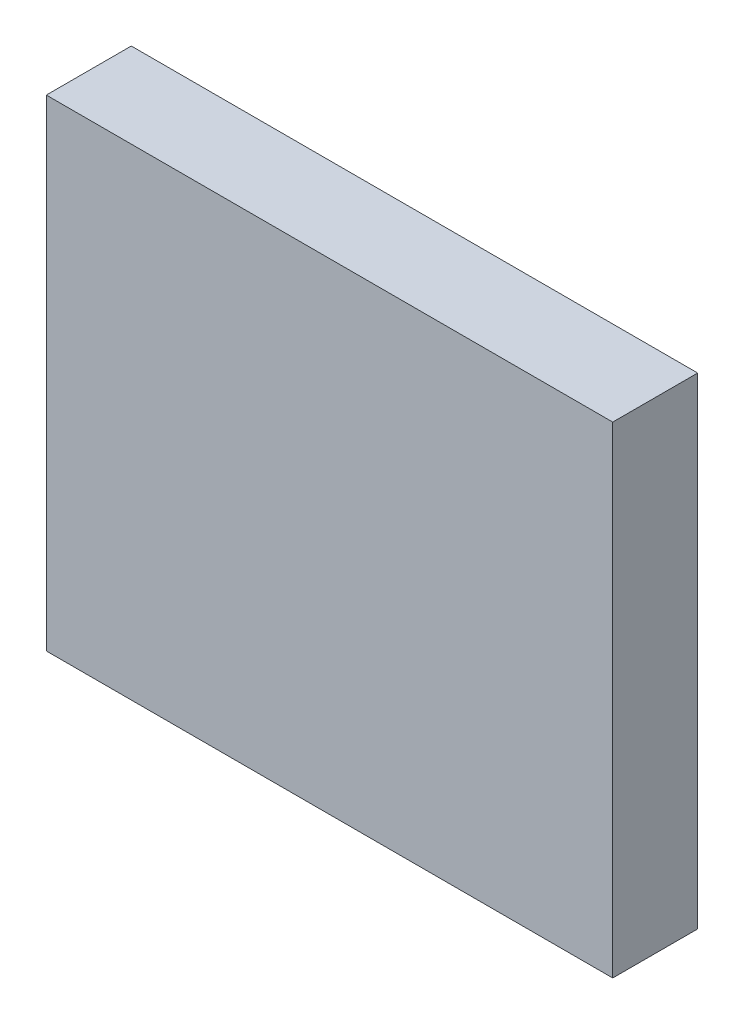
ISO-10303-21;
HEADER;
FILE_DESCRIPTION(('STEP AP214'),'2;1');
FILE_NAME('part.step','',(''),(''),'','','');
FILE_SCHEMA(('AUTOMOTIVE_DESIGN { 1 0 10303 214 1 1 1 1 }'));
ENDSEC;
DATA;
#1=APPLICATION_CONTEXT('core data for automotive mechanical design processes');
#2=APPLICATION_PROTOCOL_DEFINITION('international standard','automotive_design',2000,#1);
#3=PRODUCT_CONTEXT('',#1,'mechanical');
#4=PRODUCT('Part','Part','',(#3));
#5=PRODUCT_RELATED_PRODUCT_CATEGORY('part','',(#4));
#6=PRODUCT_DEFINITION_FORMATION('','',#4);
#7=PRODUCT_DEFINITION_CONTEXT('part definition',#1,'design');
#8=PRODUCT_DEFINITION('design','',#6,#7);
#9=PRODUCT_DEFINITION_SHAPE('','',#8);
#10=(LENGTH_UNIT() NAMED_UNIT(*) SI_UNIT(.MILLI.,.METRE.));
#11=(NAMED_UNIT(*) PLANE_ANGLE_UNIT() SI_UNIT($,.RADIAN.));
#12=(NAMED_UNIT(*) SI_UNIT($,.STERADIAN.) SOLID_ANGLE_UNIT());
#13=UNCERTAINTY_MEASURE_WITH_UNIT(LENGTH_MEASURE(1.E-05),#10,'distance_accuracy_value','');
#14=(GEOMETRIC_REPRESENTATION_CONTEXT(3) GLOBAL_UNCERTAINTY_ASSIGNED_CONTEXT((#13)) GLOBAL_UNIT_ASSIGNED_CONTEXT((#10,
#11,#12)) REPRESENTATION_CONTEXT('',''));
#15=CARTESIAN_POINT('',(0.,0.,0.));
#16=DIRECTION('',(0.,0.,1.));
#17=DIRECTION('',(1.,0.,0.));
#18=AXIS2_PLACEMENT_3D('',#15,#16,#17);
#19=CARTESIAN_POINT('',(-2.50500129639073,21.9529999999915,-5.03699993991845));
#20=DIRECTION('',(0.,-1.,0.));
#21=DIRECTION('',(0.,0.,-1.));
#22=AXIS2_PLACEMENT_3D('',#19,#20,#21);
#23=PLANE('',#22);
#24=DIRECTION('',(0.,0.,-1.));
#25=VECTOR('',#24,1.);
#26=CARTESIAN_POINT('',(12.4949987036093,21.9529999999915,-5.0369999549388));
#27=LINE('',#26,#25);
#28=CARTESIAN_POINT('',(12.4949987036093,21.9529999999915,-2.0369999399184));
#29=VERTEX_POINT('',#28);
#30=CARTESIAN_POINT('',(12.4949987036093,21.9529999999915,-8.037));
#31=VERTEX_POINT('',#30);
#32=EDGE_CURVE('E94',#29,#31,#27,.T.);
#33=ORIENTED_EDGE('',*,*,#32,.T.);
#34=DIRECTION('',(1.,0.,0.));
#35=VECTOR('',#34,1.);
#36=CARTESIAN_POINT('',(-2.50500129639072,21.9529999999915,-8.03699993991845));
#37=LINE('',#36,#35);
#38=CARTESIAN_POINT('',(-27.5050012963907,21.9529999999915,-8.03699993991852));
#39=VERTEX_POINT('',#38);
#40=EDGE_CURVE('E20',#39,#31,#37,.T.);
#41=ORIENTED_EDGE('',*,*,#40,.F.);
#42=DIRECTION('',(0.,0.,-1.));
#43=VECTOR('',#42,1.);
#44=CARTESIAN_POINT('',(-27.5050012963907,21.9529999999915,-5.03699993991852));
#45=LINE('',#44,#43);
#46=CARTESIAN_POINT('',(-27.5050012963907,21.9529999999915,-2.03699993991852));
#47=VERTEX_POINT('',#46);
#48=EDGE_CURVE('E11',#47,#39,#45,.T.);
#49=ORIENTED_EDGE('',*,*,#48,.F.);
#50=DIRECTION('',(-1.,0.,0.));
#51=VECTOR('',#50,1.);
#52=CARTESIAN_POINT('',(-2.50500129639074,21.9529999999915,-2.03699993991844));
#53=LINE('',#52,#51);
#54=EDGE_CURVE('E79',#29,#47,#53,.T.);
#55=ORIENTED_EDGE('',*,*,#54,.F.);
#56=EDGE_LOOP('',(#33,#41,#49,#55));
#57=FACE_BOUND('',#56,.T.);
#58=ADVANCED_FACE('F17',(#57),#23,.F.);
#59=CARTESIAN_POINT('',(-27.5050012963907,4.95299999999155,-5.03699993991852));
#60=DIRECTION('',(1.,0.,0.));
#61=DIRECTION('',(0.,0.,1.));
#62=AXIS2_PLACEMENT_3D('',#59,#60,#61);
#63=PLANE('',#62);
#64=ORIENTED_EDGE('',*,*,#48,.T.);
#65=DIRECTION('',(0.,1.,0.));
#66=VECTOR('',#65,1.);
#67=CARTESIAN_POINT('',(-27.5050012963907,4.95299999999155,-8.03699993991852));
#68=LINE('',#67,#66);
#69=CARTESIAN_POINT('',(-27.5050012963907,-12.0470000000085,-8.03699993991852));
#70=VERTEX_POINT('',#69);
#71=EDGE_CURVE('E59',#70,#39,#68,.T.);
#72=ORIENTED_EDGE('',*,*,#71,.F.);
#73=DIRECTION('',(0.,0.,-1.));
#74=VECTOR('',#73,1.);
#75=CARTESIAN_POINT('',(-27.5050012963907,-12.0470000000085,-5.03699993991852));
#76=LINE('',#75,#74);
#77=CARTESIAN_POINT('',(-27.5050012963907,-12.0470000000085,-2.03699993991852));
#78=VERTEX_POINT('',#77);
#79=EDGE_CURVE('E63',#78,#70,#76,.T.);
#80=ORIENTED_EDGE('',*,*,#79,.F.);
#81=DIRECTION('',(0.,-1.,0.));
#82=VECTOR('',#81,1.);
#83=CARTESIAN_POINT('',(-27.5050012963907,4.95299999999155,-2.03699993991852));
#84=LINE('',#83,#82);
#85=EDGE_CURVE('E67',#47,#78,#84,.T.);
#86=ORIENTED_EDGE('',*,*,#85,.F.);
#87=EDGE_LOOP('',(#64,#72,#80,#86));
#88=FACE_BOUND('',#87,.T.);
#89=ADVANCED_FACE('F61',(#88),#63,.F.);
#90=CARTESIAN_POINT('',(-2.50500129639072,4.95299999999155,-8.03699993991845));
#91=DIRECTION('',(0.,0.,1.));
#92=DIRECTION('',(1.,0.,0.));
#93=AXIS2_PLACEMENT_3D('',#90,#91,#92);
#94=PLANE('',#93);
#95=DIRECTION('',(0.,-1.,0.));
#96=VECTOR('',#95,1.);
#97=CARTESIAN_POINT('',(12.4949987036093,4.71474995156489,-8.0369999399184));
#98=LINE('',#97,#96);
#99=CARTESIAN_POINT('',(12.4949987036093,-12.0470000000085,-8.037));
#100=VERTEX_POINT('',#99);
#101=EDGE_CURVE('E74',#31,#100,#98,.T.);
#102=ORIENTED_EDGE('',*,*,#101,.T.);
#103=DIRECTION('',(-1.,0.,0.));
#104=VECTOR('',#103,1.);
#105=CARTESIAN_POINT('',(-2.50500129639072,-12.0470000000085,-8.03699993991845));
#106=LINE('',#105,#104);
#107=EDGE_CURVE('E70',#100,#70,#106,.T.);
#108=ORIENTED_EDGE('',*,*,#107,.T.);
#109=ORIENTED_EDGE('',*,*,#71,.T.);
#110=ORIENTED_EDGE('',*,*,#40,.T.);
#111=EDGE_LOOP('',(#102,#108,#109,#110));
#112=FACE_BOUND('',#111,.T.);
#113=ADVANCED_FACE('F71',(#112),#94,.F.);
#114=CARTESIAN_POINT('',(-2.50500129639074,4.95299999999155,-2.03699993991844));
#115=DIRECTION('',(0.,0.,1.));
#116=DIRECTION('',(1.,0.,0.));
#117=AXIS2_PLACEMENT_3D('',#114,#115,#116);
#118=PLANE('',#117);
#119=DIRECTION('',(0.,1.,0.));
#120=VECTOR('',#119,1.);
#121=CARTESIAN_POINT('',(12.4949987036093,4.71474995156489,-2.0369999399184));
#122=LINE('',#121,#120);
#123=CARTESIAN_POINT('',(12.4949987036093,-12.0470000000085,-2.0369999399184));
#124=VERTEX_POINT('',#123);
#125=EDGE_CURVE('E90',#124,#29,#122,.T.);
#126=ORIENTED_EDGE('',*,*,#125,.T.);
#127=ORIENTED_EDGE('',*,*,#54,.T.);
#128=ORIENTED_EDGE('',*,*,#85,.T.);
#129=DIRECTION('',(1.,0.,0.));
#130=VECTOR('',#129,1.);
#131=CARTESIAN_POINT('',(-2.50500129639074,-12.0470000000085,-2.03699993991844));
#132=LINE('',#131,#130);
#133=EDGE_CURVE('E83',#78,#124,#132,.T.);
#134=ORIENTED_EDGE('',*,*,#133,.T.);
#135=EDGE_LOOP('',(#126,#127,#128,#134));
#136=FACE_BOUND('',#135,.T.);
#137=ADVANCED_FACE('F106',(#136),#118,.T.);
#138=CARTESIAN_POINT('',(-2.50500129639073,-12.0470000000085,-5.03699993991845));
#139=DIRECTION('',(0.,1.,0.));
#140=DIRECTION('',(1.,0.,0.));
#141=AXIS2_PLACEMENT_3D('',#138,#139,#140);
#142=PLANE('',#141);
#143=DIRECTION('',(0.,0.,1.));
#144=VECTOR('',#143,1.);
#145=CARTESIAN_POINT('',(12.4949987036093,-12.0470000000085,-5.0369999549388));
#146=LINE('',#145,#144);
#147=EDGE_CURVE('E145',#100,#124,#146,.T.);
#148=ORIENTED_EDGE('',*,*,#147,.T.);
#149=ORIENTED_EDGE('',*,*,#133,.F.);
#150=ORIENTED_EDGE('',*,*,#79,.T.);
#151=ORIENTED_EDGE('',*,*,#107,.F.);
#152=EDGE_LOOP('',(#148,#149,#150,#151));
#153=FACE_BOUND('',#152,.T.);
#154=ADVANCED_FACE('F81',(#153),#142,.F.);
#155=CARTESIAN_POINT('',(12.4949987036093,4.47649990313823,-5.03699996995921));
#156=DIRECTION('',(1.,0.,0.));
#157=DIRECTION('',(0.,0.,1.));
#158=AXIS2_PLACEMENT_3D('',#155,#156,#157);
#159=PLANE('',#158);
#160=ORIENTED_EDGE('',*,*,#147,.F.);
#161=ORIENTED_EDGE('',*,*,#101,.F.);
#162=ORIENTED_EDGE('',*,*,#32,.F.);
#163=ORIENTED_EDGE('',*,*,#125,.F.);
#164=EDGE_LOOP('',(#160,#161,#162,#163));
#165=FACE_BOUND('',#164,.T.);
#166=ADVANCED_FACE('F155',(#165),#159,.T.);
#167=CLOSED_SHELL('',(#58,#89,#113,#137,#154,#166));
#168=MANIFOLD_SOLID_BREP('B1',#167);
#169=ADVANCED_BREP_SHAPE_REPRESENTATION('',(#18,#168),#14);
#170=SHAPE_DEFINITION_REPRESENTATION(#9,#169);
ENDSEC;
END-ISO-10303-21;
